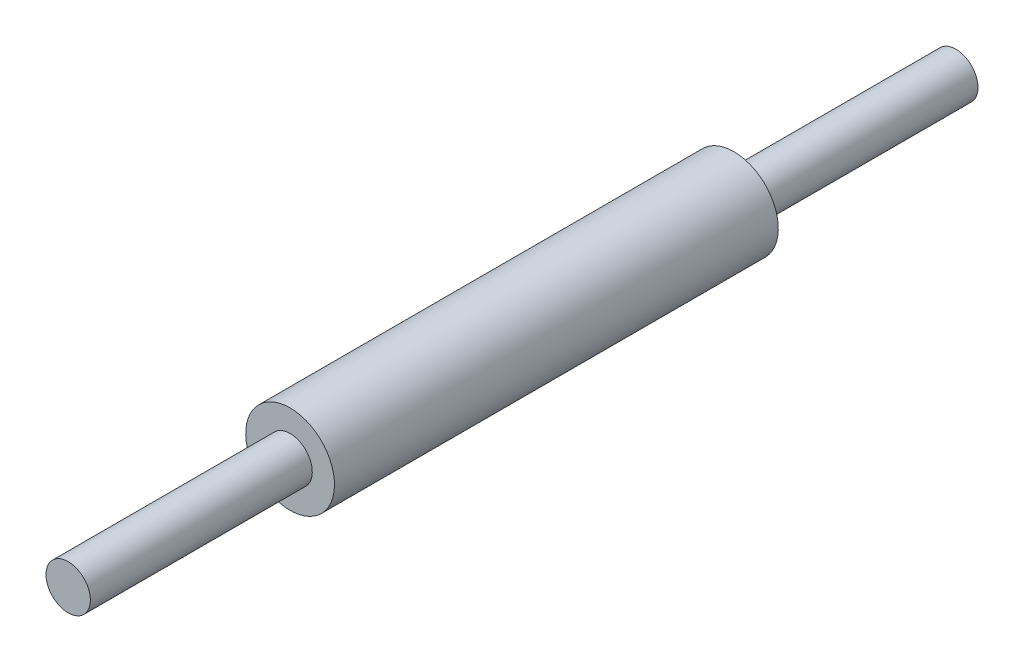
ISO-10303-21;
HEADER;
FILE_DESCRIPTION(('STEP AP214'),'2;1');
FILE_NAME('part.step','',(''),(''),'','','');
FILE_SCHEMA(('AUTOMOTIVE_DESIGN { 1 0 10303 214 1 1 1 1 }'));
ENDSEC;
DATA;
#1=APPLICATION_CONTEXT('core data for automotive mechanical design processes');
#2=APPLICATION_PROTOCOL_DEFINITION('international standard','automotive_design',2000,#1);
#3=PRODUCT_CONTEXT('',#1,'mechanical');
#4=PRODUCT('Part','Part','',(#3));
#5=PRODUCT_RELATED_PRODUCT_CATEGORY('part','',(#4));
#6=PRODUCT_DEFINITION_FORMATION('','',#4);
#7=PRODUCT_DEFINITION_CONTEXT('part definition',#1,'design');
#8=PRODUCT_DEFINITION('design','',#6,#7);
#9=PRODUCT_DEFINITION_SHAPE('','',#8);
#10=(LENGTH_UNIT() NAMED_UNIT(*) SI_UNIT(.MILLI.,.METRE.));
#11=(NAMED_UNIT(*) PLANE_ANGLE_UNIT() SI_UNIT($,.RADIAN.));
#12=(NAMED_UNIT(*) SI_UNIT($,.STERADIAN.) SOLID_ANGLE_UNIT());
#13=UNCERTAINTY_MEASURE_WITH_UNIT(LENGTH_MEASURE(1.E-05),#10,'distance_accuracy_value','');
#14=(GEOMETRIC_REPRESENTATION_CONTEXT(3) GLOBAL_UNCERTAINTY_ASSIGNED_CONTEXT((#13)) GLOBAL_UNIT_ASSIGNED_CONTEXT((#10,
#11,#12)) REPRESENTATION_CONTEXT('',''));
#15=CARTESIAN_POINT('',(0.,0.,0.));
#16=DIRECTION('',(0.,0.,1.));
#17=DIRECTION('',(1.,0.,0.));
#18=AXIS2_PLACEMENT_3D('',#15,#16,#17);
#19=CARTESIAN_POINT('',(0.,0.,0.));
#20=DIRECTION('',(0.,0.,1.));
#21=DIRECTION('',(0.,-1.,0.));
#22=AXIS2_PLACEMENT_3D('',#19,#20,#21);
#23=PLANE('',#22);
#24=CARTESIAN_POINT('',(0.,0.,0.));
#25=DIRECTION('',(0.,0.,-1.));
#26=DIRECTION('',(0.,1.,0.));
#27=AXIS2_PLACEMENT_3D('',#24,#25,#26);
#28=CIRCLE('',#27,3.175);
#29=CARTESIAN_POINT('',(0.,3.175,0.));
#30=VERTEX_POINT('',#29);
#31=EDGE_CURVE('E10',#30,#30,#28,.T.);
#32=ORIENTED_EDGE('',*,*,#31,.F.);
#33=EDGE_LOOP('',(#32));
#34=FACE_BOUND('',#33,.T.);
#35=ADVANCED_FACE('F31',(#34),#23,.T.);
#36=CARTESIAN_POINT('',(0.,0.,-127.));
#37=DIRECTION('',(0.,0.,-1.));
#38=DIRECTION('',(0.,1.,0.));
#39=AXIS2_PLACEMENT_3D('',#36,#37,#38);
#40=CYLINDRICAL_SURFACE('',#39,3.175);
#41=ORIENTED_EDGE('',*,*,#31,.T.);
#42=EDGE_LOOP('',(#41));
#43=FACE_BOUND('',#42,.T.);
#44=CARTESIAN_POINT('',(0.,0.,-31.75));
#45=DIRECTION('',(0.,0.,-1.));
#46=DIRECTION('',(0.,1.,0.));
#47=AXIS2_PLACEMENT_3D('',#44,#45,#46);
#48=CIRCLE('',#47,3.175);
#49=CARTESIAN_POINT('',(0.,3.175,-31.75));
#50=VERTEX_POINT('',#49);
#51=EDGE_CURVE('E37',#50,#50,#48,.T.);
#52=ORIENTED_EDGE('',*,*,#51,.F.);
#53=EDGE_LOOP('',(#52));
#54=FACE_BOUND('',#53,.T.);
#55=ADVANCED_FACE('F73',(#43,#54),#40,.T.);
#56=CARTESIAN_POINT('',(0.,3.175,-31.75));
#57=DIRECTION('',(0.,0.,1.));
#58=DIRECTION('',(0.,-1.,0.));
#59=AXIS2_PLACEMENT_3D('',#56,#57,#58);
#60=PLANE('',#59);
#61=ORIENTED_EDGE('',*,*,#51,.T.);
#62=EDGE_LOOP('',(#61));
#63=FACE_BOUND('',#62,.T.);
#64=CARTESIAN_POINT('',(0.,0.,-31.75));
#65=DIRECTION('',(0.,0.,-1.));
#66=DIRECTION('',(0.,1.,0.));
#67=AXIS2_PLACEMENT_3D('',#64,#65,#66);
#68=CIRCLE('',#67,6.35);
#69=CARTESIAN_POINT('',(0.,6.35,-31.75));
#70=VERTEX_POINT('',#69);
#71=EDGE_CURVE('E41',#70,#70,#68,.T.);
#72=ORIENTED_EDGE('',*,*,#71,.F.);
#73=EDGE_LOOP('',(#72));
#74=FACE_BOUND('',#73,.T.);
#75=ADVANCED_FACE('F78',(#63,#74),#60,.T.);
#76=CARTESIAN_POINT('',(0.,0.,-127.));
#77=DIRECTION('',(0.,0.,-1.));
#78=DIRECTION('',(0.,1.,0.));
#79=AXIS2_PLACEMENT_3D('',#76,#77,#78);
#80=CYLINDRICAL_SURFACE('',#79,6.35);
#81=ORIENTED_EDGE('',*,*,#71,.T.);
#82=EDGE_LOOP('',(#81));
#83=FACE_BOUND('',#82,.T.);
#84=CARTESIAN_POINT('',(0.,0.,-95.25));
#85=DIRECTION('',(0.,0.,-1.));
#86=DIRECTION('',(0.,1.,0.));
#87=AXIS2_PLACEMENT_3D('',#84,#85,#86);
#88=CIRCLE('',#87,6.35);
#89=CARTESIAN_POINT('',(0.,6.35,-95.25));
#90=VERTEX_POINT('',#89);
#91=EDGE_CURVE('E45',#90,#90,#88,.T.);
#92=ORIENTED_EDGE('',*,*,#91,.F.);
#93=EDGE_LOOP('',(#92));
#94=FACE_BOUND('',#93,.T.);
#95=ADVANCED_FACE('F69',(#83,#94),#80,.T.);
#96=CARTESIAN_POINT('',(0.,6.35,-95.25));
#97=DIRECTION('',(0.,0.,-1.));
#98=DIRECTION('',(0.,1.,0.));
#99=AXIS2_PLACEMENT_3D('',#96,#97,#98);
#100=PLANE('',#99);
#101=ORIENTED_EDGE('',*,*,#91,.T.);
#102=EDGE_LOOP('',(#101));
#103=FACE_BOUND('',#102,.T.);
#104=CARTESIAN_POINT('',(0.,0.,-95.25));
#105=DIRECTION('',(0.,0.,-1.));
#106=DIRECTION('',(0.,1.,0.));
#107=AXIS2_PLACEMENT_3D('',#104,#105,#106);
#108=CIRCLE('',#107,3.175);
#109=CARTESIAN_POINT('',(0.,3.175,-95.25));
#110=VERTEX_POINT('',#109);
#111=EDGE_CURVE('E50',#110,#110,#108,.T.);
#112=ORIENTED_EDGE('',*,*,#111,.F.);
#113=EDGE_LOOP('',(#112));
#114=FACE_BOUND('',#113,.T.);
#115=ADVANCED_FACE('F61',(#103,#114),#100,.T.);
#116=CARTESIAN_POINT('',(0.,0.,-127.));
#117=DIRECTION('',(0.,0.,-1.));
#118=DIRECTION('',(0.,1.,0.));
#119=AXIS2_PLACEMENT_3D('',#116,#117,#118);
#120=CYLINDRICAL_SURFACE('',#119,3.175);
#121=ORIENTED_EDGE('',*,*,#111,.T.);
#122=EDGE_LOOP('',(#121));
#123=FACE_BOUND('',#122,.T.);
#124=CARTESIAN_POINT('',(0.,0.,-127.));
#125=DIRECTION('',(0.,0.,-1.));
#126=DIRECTION('',(0.,1.,0.));
#127=AXIS2_PLACEMENT_3D('',#124,#125,#126);
#128=CIRCLE('',#127,3.17499999999999);
#129=CARTESIAN_POINT('',(0.,3.175,-127.));
#130=VERTEX_POINT('',#129);
#131=EDGE_CURVE('E53',#130,#130,#128,.T.);
#132=ORIENTED_EDGE('',*,*,#131,.F.);
#133=EDGE_LOOP('',(#132));
#134=FACE_BOUND('',#133,.T.);
#135=ADVANCED_FACE('F59',(#123,#134),#120,.T.);
#136=CARTESIAN_POINT('',(0.,3.175,-127.));
#137=DIRECTION('',(0.,0.,-1.));
#138=DIRECTION('',(0.,1.,0.));
#139=AXIS2_PLACEMENT_3D('',#136,#137,#138);
#140=PLANE('',#139);
#141=ORIENTED_EDGE('',*,*,#131,.T.);
#142=EDGE_LOOP('',(#141));
#143=FACE_BOUND('',#142,.T.);
#144=ADVANCED_FACE('F57',(#143),#140,.T.);
#145=CLOSED_SHELL('',(#35,#55,#75,#95,#115,#135,#144));
#146=MANIFOLD_SOLID_BREP('B2',#145);
#147=ADVANCED_BREP_SHAPE_REPRESENTATION('',(#18,#146),#14);
#148=SHAPE_DEFINITION_REPRESENTATION(#9,#147);
ENDSEC;
END-ISO-10303-21;
